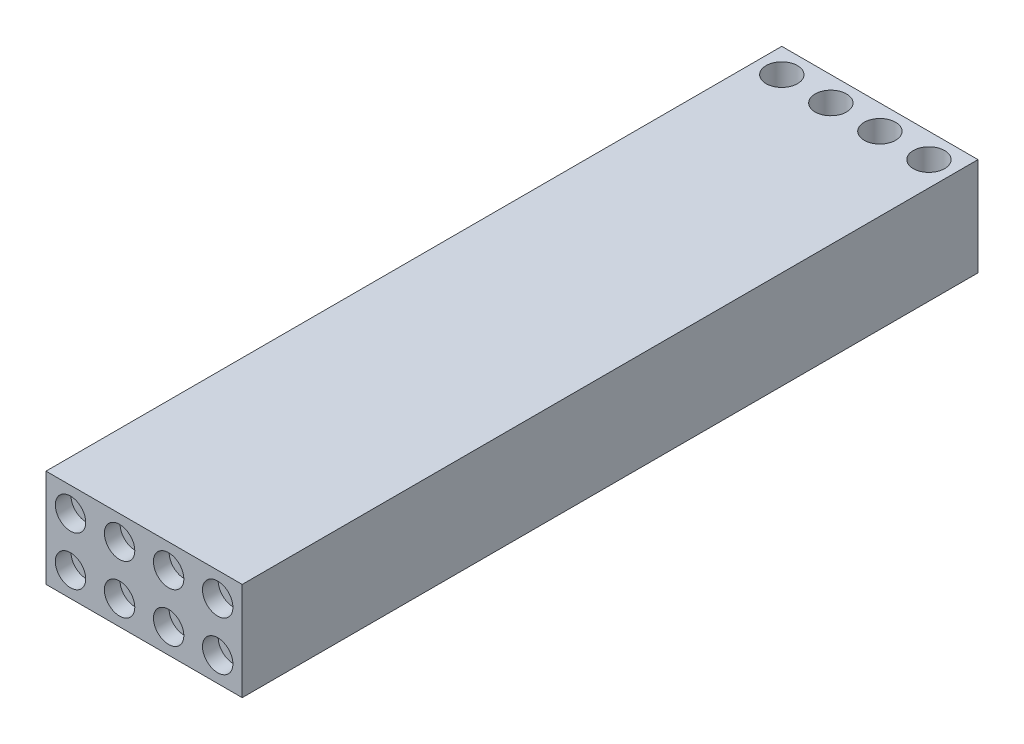
ISO-10303-21;
HEADER;
FILE_DESCRIPTION(('STEP AP214'),'2;1');
FILE_NAME('part.step','',(''),(''),'','','');
FILE_SCHEMA(('AUTOMOTIVE_DESIGN { 1 0 10303 214 1 1 1 1 }'));
ENDSEC;
DATA;
#1=APPLICATION_CONTEXT('core data for automotive mechanical design processes');
#2=APPLICATION_PROTOCOL_DEFINITION('international standard','automotive_design',2000,#1);
#3=PRODUCT_CONTEXT('',#1,'mechanical');
#4=PRODUCT('Part','Part','',(#3));
#5=PRODUCT_RELATED_PRODUCT_CATEGORY('part','',(#4));
#6=PRODUCT_DEFINITION_FORMATION('','',#4);
#7=PRODUCT_DEFINITION_CONTEXT('part definition',#1,'design');
#8=PRODUCT_DEFINITION('design','',#6,#7);
#9=PRODUCT_DEFINITION_SHAPE('','',#8);
#10=(LENGTH_UNIT() NAMED_UNIT(*) SI_UNIT(.MILLI.,.METRE.));
#11=(NAMED_UNIT(*) PLANE_ANGLE_UNIT() SI_UNIT($,.RADIAN.));
#12=(NAMED_UNIT(*) SI_UNIT($,.STERADIAN.) SOLID_ANGLE_UNIT());
#13=UNCERTAINTY_MEASURE_WITH_UNIT(LENGTH_MEASURE(1.E-05),#10,'distance_accuracy_value','');
#14=(GEOMETRIC_REPRESENTATION_CONTEXT(3) GLOBAL_UNCERTAINTY_ASSIGNED_CONTEXT((#13)) GLOBAL_UNIT_ASSIGNED_CONTEXT((#10,
#11,#12)) REPRESENTATION_CONTEXT('',''));
#15=CARTESIAN_POINT('',(0.,0.,0.));
#16=DIRECTION('',(0.,0.,1.));
#17=DIRECTION('',(1.,0.,0.));
#18=AXIS2_PLACEMENT_3D('',#15,#16,#17);
#19=CARTESIAN_POINT('',(10.,10.,150.));
#20=DIRECTION('',(-1.,0.,0.));
#21=DIRECTION('',(0.,-1.,0.));
#22=AXIS2_PLACEMENT_3D('',#19,#20,#21);
#23=PLANE('',#22);
#24=DIRECTION('',(0.,1.,0.));
#25=VECTOR('',#24,1.);
#26=CARTESIAN_POINT('',(10.,10.,0.));
#27=LINE('',#26,#25);
#28=CARTESIAN_POINT('',(10.,-10.,0.));
#29=VERTEX_POINT('',#28);
#30=CARTESIAN_POINT('',(10.,10.,0.));
#31=VERTEX_POINT('',#30);
#32=EDGE_CURVE('E87',#29,#31,#27,.T.);
#33=ORIENTED_EDGE('',*,*,#32,.T.);
#34=DIRECTION('',(0.,0.,-1.));
#35=VECTOR('',#34,1.);
#36=CARTESIAN_POINT('',(10.,10.,150.));
#37=LINE('',#36,#35);
#38=CARTESIAN_POINT('',(10.,10.,150.));
#39=VERTEX_POINT('',#38);
#40=EDGE_CURVE('E11',#39,#31,#37,.T.);
#41=ORIENTED_EDGE('',*,*,#40,.F.);
#42=DIRECTION('',(0.,1.,0.));
#43=VECTOR('',#42,1.);
#44=CARTESIAN_POINT('',(10.,10.,150.));
#45=LINE('',#44,#43);
#46=CARTESIAN_POINT('',(10.,-10.,150.));
#47=VERTEX_POINT('',#46);
#48=EDGE_CURVE('E144',#47,#39,#45,.T.);
#49=ORIENTED_EDGE('',*,*,#48,.F.);
#50=DIRECTION('',(0.,0.,-1.));
#51=VECTOR('',#50,1.);
#52=CARTESIAN_POINT('',(10.,-10.,150.));
#53=LINE('',#52,#51);
#54=EDGE_CURVE('E47',#47,#29,#53,.T.);
#55=ORIENTED_EDGE('',*,*,#54,.T.);
#56=EDGE_LOOP('',(#33,#41,#49,#55));
#57=FACE_BOUND('',#56,.T.);
#58=ADVANCED_FACE('F39',(#57),#23,.F.);
#59=CARTESIAN_POINT('',(-10.,10.,150.));
#60=DIRECTION('',(0.,-1.,0.));
#61=DIRECTION('',(0.,0.,-1.));
#62=AXIS2_PLACEMENT_3D('',#59,#60,#61);
#63=PLANE('',#62);
#64=CARTESIAN_POINT('',(-25.,9.99999999999999,5.));
#65=DIRECTION('',(0.,-1.,0.));
#66=DIRECTION('',(0.,0.,1.));
#67=AXIS2_PLACEMENT_3D('',#64,#65,#66);
#68=CIRCLE('',#67,3.2);
#69=CARTESIAN_POINT('',(-25.,9.99999999999999,8.2));
#70=VERTEX_POINT('',#69);
#71=EDGE_CURVE('E180',#70,#70,#68,.T.);
#72=ORIENTED_EDGE('',*,*,#71,.T.);
#73=EDGE_LOOP('',(#72));
#74=FACE_BOUND('',#73,.T.);
#75=CARTESIAN_POINT('',(-15.,9.99999999999999,5.));
#76=DIRECTION('',(0.,1.,0.));
#77=DIRECTION('',(0.,0.,1.));
#78=AXIS2_PLACEMENT_3D('',#75,#76,#77);
#79=CIRCLE('',#78,3.2);
#80=CARTESIAN_POINT('',(-15.,9.99999999999999,8.2));
#81=VERTEX_POINT('',#80);
#82=EDGE_CURVE('E103',#81,#81,#79,.T.);
#83=ORIENTED_EDGE('',*,*,#82,.F.);
#84=EDGE_LOOP('',(#83));
#85=FACE_BOUND('',#84,.T.);
#86=CARTESIAN_POINT('',(-5.,10.,5.));
#87=DIRECTION('',(0.,-1.,0.));
#88=DIRECTION('',(0.,0.,1.));
#89=AXIS2_PLACEMENT_3D('',#86,#87,#88);
#90=CIRCLE('',#89,3.2);
#91=CARTESIAN_POINT('',(-5.,10.,8.2));
#92=VERTEX_POINT('',#91);
#93=EDGE_CURVE('E130',#92,#92,#90,.T.);
#94=ORIENTED_EDGE('',*,*,#93,.T.);
#95=EDGE_LOOP('',(#94));
#96=FACE_BOUND('',#95,.T.);
#97=CARTESIAN_POINT('',(5.,10.,5.));
#98=DIRECTION('',(0.,1.,0.));
#99=DIRECTION('',(0.,0.,1.));
#100=AXIS2_PLACEMENT_3D('',#97,#98,#99);
#101=CIRCLE('',#100,3.2);
#102=CARTESIAN_POINT('',(5.,10.,8.2));
#103=VERTEX_POINT('',#102);
#104=EDGE_CURVE('E136',#103,#103,#101,.T.);
#105=ORIENTED_EDGE('',*,*,#104,.F.);
#106=EDGE_LOOP('',(#105));
#107=FACE_BOUND('',#106,.T.);
#108=DIRECTION('',(-1.,0.,0.));
#109=VECTOR('',#108,1.);
#110=CARTESIAN_POINT('',(-10.,10.,0.));
#111=LINE('',#110,#109);
#112=CARTESIAN_POINT('',(-30.,9.99999999999999,0.));
#113=VERTEX_POINT('',#112);
#114=EDGE_CURVE('E67',#31,#113,#111,.T.);
#115=ORIENTED_EDGE('',*,*,#114,.T.);
#116=DIRECTION('',(0.,0.,-1.));
#117=VECTOR('',#116,1.);
#118=CARTESIAN_POINT('',(-30.,9.99999999999999,150.));
#119=LINE('',#118,#117);
#120=CARTESIAN_POINT('',(-30.,9.99999999999999,150.));
#121=VERTEX_POINT('',#120);
#122=EDGE_CURVE('E82',#121,#113,#119,.T.);
#123=ORIENTED_EDGE('',*,*,#122,.F.);
#124=DIRECTION('',(-1.,0.,0.));
#125=VECTOR('',#124,1.);
#126=CARTESIAN_POINT('',(-10.,10.,150.));
#127=LINE('',#126,#125);
#128=EDGE_CURVE('E72',#39,#121,#127,.T.);
#129=ORIENTED_EDGE('',*,*,#128,.F.);
#130=ORIENTED_EDGE('',*,*,#40,.T.);
#131=EDGE_LOOP('',(#115,#123,#129,#130));
#132=FACE_BOUND('',#131,.T.);
#133=ADVANCED_FACE('F81',(#74,#85,#96,#107,#132),#63,.F.);
#134=CARTESIAN_POINT('',(-10.,-10.,150.));
#135=DIRECTION('',(0.,1.,0.));
#136=DIRECTION('',(0.,0.,1.));
#137=AXIS2_PLACEMENT_3D('',#134,#135,#136);
#138=PLANE('',#137);
#139=DIRECTION('',(1.,0.,0.));
#140=VECTOR('',#139,1.);
#141=CARTESIAN_POINT('',(-10.,-10.,0.));
#142=LINE('',#141,#140);
#143=CARTESIAN_POINT('',(-30.,-10.,0.));
#144=VERTEX_POINT('',#143);
#145=EDGE_CURVE('E86',#144,#29,#142,.T.);
#146=ORIENTED_EDGE('',*,*,#145,.T.);
#147=ORIENTED_EDGE('',*,*,#54,.F.);
#148=DIRECTION('',(1.,0.,0.));
#149=VECTOR('',#148,1.);
#150=CARTESIAN_POINT('',(-10.,-10.,150.));
#151=LINE('',#150,#149);
#152=CARTESIAN_POINT('',(-30.,-10.,150.));
#153=VERTEX_POINT('',#152);
#154=EDGE_CURVE('E55',#153,#47,#151,.T.);
#155=ORIENTED_EDGE('',*,*,#154,.F.);
#156=DIRECTION('',(0.,0.,-1.));
#157=VECTOR('',#156,1.);
#158=CARTESIAN_POINT('',(-30.,-10.,150.));
#159=LINE('',#158,#157);
#160=EDGE_CURVE('E95',#153,#144,#159,.T.);
#161=ORIENTED_EDGE('',*,*,#160,.T.);
#162=EDGE_LOOP('',(#146,#147,#155,#161));
#163=FACE_BOUND('',#162,.T.);
#164=ADVANCED_FACE('F153',(#163),#138,.F.);
#165=CARTESIAN_POINT('',(0.,0.,150.));
#166=DIRECTION('',(0.,0.,1.));
#167=DIRECTION('',(1.,0.,0.));
#168=AXIS2_PLACEMENT_3D('',#165,#166,#167);
#169=PLANE('',#168);
#170=CARTESIAN_POINT('',(-25.,-5.,150.));
#171=DIRECTION('',(0.,0.,1.));
#172=DIRECTION('',(-1.,0.,0.));
#173=AXIS2_PLACEMENT_3D('',#170,#171,#172);
#174=CIRCLE('',#173,3.1);
#175=CARTESIAN_POINT('',(-28.1,-5.,150.));
#176=VERTEX_POINT('',#175);
#177=EDGE_CURVE('E291',#176,#176,#174,.T.);
#178=ORIENTED_EDGE('',*,*,#177,.F.);
#179=EDGE_LOOP('',(#178));
#180=FACE_BOUND('',#179,.T.);
#181=CARTESIAN_POINT('',(-25.,4.99999999999999,150.));
#182=DIRECTION('',(0.,0.,-1.));
#183=DIRECTION('',(-1.,0.,0.));
#184=AXIS2_PLACEMENT_3D('',#181,#182,#183);
#185=CIRCLE('',#184,3.1);
#186=CARTESIAN_POINT('',(-28.1,4.99999999999999,150.));
#187=VERTEX_POINT('',#186);
#188=EDGE_CURVE('E290',#187,#187,#185,.T.);
#189=ORIENTED_EDGE('',*,*,#188,.T.);
#190=EDGE_LOOP('',(#189));
#191=FACE_BOUND('',#190,.T.);
#192=CARTESIAN_POINT('',(-15.,-5.,150.));
#193=DIRECTION('',(0.,0.,-1.));
#194=DIRECTION('',(1.,0.,0.));
#195=AXIS2_PLACEMENT_3D('',#192,#193,#194);
#196=CIRCLE('',#195,3.1);
#197=CARTESIAN_POINT('',(-11.9,-5.,150.));
#198=VERTEX_POINT('',#197);
#199=EDGE_CURVE('E304',#198,#198,#196,.T.);
#200=ORIENTED_EDGE('',*,*,#199,.T.);
#201=EDGE_LOOP('',(#200));
#202=FACE_BOUND('',#201,.T.);
#203=CARTESIAN_POINT('',(-15.,4.99999999999999,150.));
#204=DIRECTION('',(0.,0.,1.));
#205=DIRECTION('',(1.,0.,0.));
#206=AXIS2_PLACEMENT_3D('',#203,#204,#205);
#207=CIRCLE('',#206,3.1);
#208=CARTESIAN_POINT('',(-11.9,4.99999999999999,150.));
#209=VERTEX_POINT('',#208);
#210=EDGE_CURVE('E309',#209,#209,#207,.T.);
#211=ORIENTED_EDGE('',*,*,#210,.F.);
#212=EDGE_LOOP('',(#211));
#213=FACE_BOUND('',#212,.T.);
#214=CARTESIAN_POINT('',(-5.,-5.,150.));
#215=DIRECTION('',(0.,0.,1.));
#216=DIRECTION('',(-1.,0.,0.));
#217=AXIS2_PLACEMENT_3D('',#214,#215,#216);
#218=CIRCLE('',#217,3.1);
#219=CARTESIAN_POINT('',(-8.1,-5.,150.));
#220=VERTEX_POINT('',#219);
#221=EDGE_CURVE('E108',#220,#220,#218,.T.);
#222=ORIENTED_EDGE('',*,*,#221,.F.);
#223=EDGE_LOOP('',(#222));
#224=FACE_BOUND('',#223,.T.);
#225=CARTESIAN_POINT('',(-5.,5.,150.));
#226=DIRECTION('',(0.,0.,-1.));
#227=DIRECTION('',(-1.,0.,0.));
#228=AXIS2_PLACEMENT_3D('',#225,#226,#227);
#229=CIRCLE('',#228,3.1);
#230=CARTESIAN_POINT('',(-8.1,5.,150.));
#231=VERTEX_POINT('',#230);
#232=EDGE_CURVE('E112',#231,#231,#229,.T.);
#233=ORIENTED_EDGE('',*,*,#232,.T.);
#234=EDGE_LOOP('',(#233));
#235=FACE_BOUND('',#234,.T.);
#236=CARTESIAN_POINT('',(5.,-5.,150.));
#237=DIRECTION('',(0.,0.,-1.));
#238=DIRECTION('',(1.,0.,0.));
#239=AXIS2_PLACEMENT_3D('',#236,#237,#238);
#240=CIRCLE('',#239,3.1);
#241=CARTESIAN_POINT('',(8.1,-5.,150.));
#242=VERTEX_POINT('',#241);
#243=EDGE_CURVE('E118',#242,#242,#240,.T.);
#244=ORIENTED_EDGE('',*,*,#243,.T.);
#245=EDGE_LOOP('',(#244));
#246=FACE_BOUND('',#245,.T.);
#247=CARTESIAN_POINT('',(5.,5.,150.));
#248=DIRECTION('',(0.,0.,1.));
#249=DIRECTION('',(1.,0.,0.));
#250=AXIS2_PLACEMENT_3D('',#247,#248,#249);
#251=CIRCLE('',#250,3.1);
#252=CARTESIAN_POINT('',(8.1,5.,150.));
#253=VERTEX_POINT('',#252);
#254=EDGE_CURVE('E124',#253,#253,#251,.T.);
#255=ORIENTED_EDGE('',*,*,#254,.F.);
#256=EDGE_LOOP('',(#255));
#257=FACE_BOUND('',#256,.T.);
#258=ORIENTED_EDGE('',*,*,#48,.T.);
#259=ORIENTED_EDGE('',*,*,#128,.T.);
#260=DIRECTION('',(0.,1.,0.));
#261=VECTOR('',#260,1.);
#262=CARTESIAN_POINT('',(-30.,9.99999999999999,150.));
#263=LINE('',#262,#261);
#264=EDGE_CURVE('E94',#153,#121,#263,.T.);
#265=ORIENTED_EDGE('',*,*,#264,.F.);
#266=ORIENTED_EDGE('',*,*,#154,.T.);
#267=EDGE_LOOP('',(#258,#259,#265,#266));
#268=FACE_BOUND('',#267,.T.);
#269=ADVANCED_FACE('F154',(#180,#191,#202,#213,#224,#235,#246,#257,#268),#169,.T.);
#270=CARTESIAN_POINT('',(0.,0.,0.));
#271=DIRECTION('',(0.,0.,1.));
#272=DIRECTION('',(1.,0.,0.));
#273=AXIS2_PLACEMENT_3D('',#270,#271,#272);
#274=PLANE('',#273);
#275=ORIENTED_EDGE('',*,*,#32,.F.);
#276=ORIENTED_EDGE('',*,*,#145,.F.);
#277=DIRECTION('',(0.,1.,0.));
#278=VECTOR('',#277,1.);
#279=CARTESIAN_POINT('',(-30.,9.99999999999999,0.));
#280=LINE('',#279,#278);
#281=EDGE_CURVE('E93',#144,#113,#280,.T.);
#282=ORIENTED_EDGE('',*,*,#281,.T.);
#283=ORIENTED_EDGE('',*,*,#114,.F.);
#284=EDGE_LOOP('',(#275,#276,#282,#283));
#285=FACE_BOUND('',#284,.T.);
#286=ADVANCED_FACE('F97',(#285),#274,.F.);
#287=CARTESIAN_POINT('',(5.,-8.,5.));
#288=DIRECTION('',(0.,1.,0.));
#289=DIRECTION('',(0.,0.,1.));
#290=AXIS2_PLACEMENT_3D('',#287,#288,#289);
#291=CYLINDRICAL_SURFACE('',#290,3.2);
#292=CARTESIAN_POINT('',(5.,-8.,5.));
#293=DIRECTION('',(0.,1.,0.));
#294=DIRECTION('',(0.,0.,1.));
#295=AXIS2_PLACEMENT_3D('',#292,#293,#294);
#296=CIRCLE('',#295,3.2);
#297=CARTESIAN_POINT('',(5.,-8.,8.2));
#298=VERTEX_POINT('',#297);
#299=EDGE_CURVE('E139',#298,#298,#296,.T.);
#300=ORIENTED_EDGE('',*,*,#299,.F.);
#301=EDGE_LOOP('',(#300));
#302=FACE_BOUND('',#301,.T.);
#303=ORIENTED_EDGE('',*,*,#104,.T.);
#304=EDGE_LOOP('',(#303));
#305=FACE_BOUND('',#304,.T.);
#306=ADVANCED_FACE('F162',(#302,#305),#291,.F.);
#307=CARTESIAN_POINT('',(5.,-8.,5.));
#308=DIRECTION('',(0.,1.,0.));
#309=DIRECTION('',(0.,0.,1.));
#310=AXIS2_PLACEMENT_3D('',#307,#308,#309);
#311=PLANE('',#310);
#312=ORIENTED_EDGE('',*,*,#299,.T.);
#313=EDGE_LOOP('',(#312));
#314=FACE_BOUND('',#313,.T.);
#315=ADVANCED_FACE('F188',(#314),#311,.T.);
#316=CARTESIAN_POINT('',(-5.,-8.,5.));
#317=DIRECTION('',(0.,1.,0.));
#318=DIRECTION('',(0.,0.,1.));
#319=AXIS2_PLACEMENT_3D('',#316,#317,#318);
#320=CYLINDRICAL_SURFACE('',#319,3.2);
#321=CARTESIAN_POINT('',(-5.,-8.,5.));
#322=DIRECTION('',(0.,-1.,0.));
#323=DIRECTION('',(0.,0.,1.));
#324=AXIS2_PLACEMENT_3D('',#321,#322,#323);
#325=CIRCLE('',#324,3.2);
#326=CARTESIAN_POINT('',(-5.,-8.,8.2));
#327=VERTEX_POINT('',#326);
#328=EDGE_CURVE('E133',#327,#327,#325,.T.);
#329=ORIENTED_EDGE('',*,*,#328,.T.);
#330=EDGE_LOOP('',(#329));
#331=FACE_BOUND('',#330,.T.);
#332=ORIENTED_EDGE('',*,*,#93,.F.);
#333=EDGE_LOOP('',(#332));
#334=FACE_BOUND('',#333,.T.);
#335=ADVANCED_FACE('F193',(#331,#334),#320,.F.);
#336=CARTESIAN_POINT('',(-5.,-8.,5.));
#337=DIRECTION('',(0.,1.,0.));
#338=DIRECTION('',(0.,0.,1.));
#339=AXIS2_PLACEMENT_3D('',#336,#337,#338);
#340=PLANE('',#339);
#341=ORIENTED_EDGE('',*,*,#328,.F.);
#342=EDGE_LOOP('',(#341));
#343=FACE_BOUND('',#342,.T.);
#344=ADVANCED_FACE('F200',(#343),#340,.T.);
#345=CARTESIAN_POINT('',(5.,5.,146.8));
#346=DIRECTION('',(0.,0.,1.));
#347=DIRECTION('',(1.,0.,0.));
#348=AXIS2_PLACEMENT_3D('',#345,#346,#347);
#349=CYLINDRICAL_SURFACE('',#348,3.1);
#350=CARTESIAN_POINT('',(5.,5.,146.8));
#351=DIRECTION('',(0.,0.,1.));
#352=DIRECTION('',(1.,0.,0.));
#353=AXIS2_PLACEMENT_3D('',#350,#351,#352);
#354=CIRCLE('',#353,3.1);
#355=CARTESIAN_POINT('',(8.1,5.,146.8));
#356=VERTEX_POINT('',#355);
#357=EDGE_CURVE('E127',#356,#356,#354,.T.);
#358=ORIENTED_EDGE('',*,*,#357,.F.);
#359=EDGE_LOOP('',(#358));
#360=FACE_BOUND('',#359,.T.);
#361=ORIENTED_EDGE('',*,*,#254,.T.);
#362=EDGE_LOOP('',(#361));
#363=FACE_BOUND('',#362,.T.);
#364=ADVANCED_FACE('F204',(#360,#363),#349,.F.);
#365=CARTESIAN_POINT('',(5.,5.,146.8));
#366=DIRECTION('',(0.,0.,1.));
#367=DIRECTION('',(1.,0.,0.));
#368=AXIS2_PLACEMENT_3D('',#365,#366,#367);
#369=PLANE('',#368);
#370=ORIENTED_EDGE('',*,*,#357,.T.);
#371=EDGE_LOOP('',(#370));
#372=FACE_BOUND('',#371,.T.);
#373=ADVANCED_FACE('F208',(#372),#369,.T.);
#374=CARTESIAN_POINT('',(5.,-5.,146.8));
#375=DIRECTION('',(0.,0.,1.));
#376=DIRECTION('',(1.,0.,0.));
#377=AXIS2_PLACEMENT_3D('',#374,#375,#376);
#378=CYLINDRICAL_SURFACE('',#377,3.1);
#379=CARTESIAN_POINT('',(5.,-5.,146.8));
#380=DIRECTION('',(0.,0.,-1.));
#381=DIRECTION('',(1.,0.,0.));
#382=AXIS2_PLACEMENT_3D('',#379,#380,#381);
#383=CIRCLE('',#382,3.1);
#384=CARTESIAN_POINT('',(8.1,-5.,146.8));
#385=VERTEX_POINT('',#384);
#386=EDGE_CURVE('E121',#385,#385,#383,.T.);
#387=ORIENTED_EDGE('',*,*,#386,.T.);
#388=EDGE_LOOP('',(#387));
#389=FACE_BOUND('',#388,.T.);
#390=ORIENTED_EDGE('',*,*,#243,.F.);
#391=EDGE_LOOP('',(#390));
#392=FACE_BOUND('',#391,.T.);
#393=ADVANCED_FACE('F212',(#389,#392),#378,.F.);
#394=CARTESIAN_POINT('',(5.,-5.,146.8));
#395=DIRECTION('',(0.,0.,1.));
#396=DIRECTION('',(1.,0.,0.));
#397=AXIS2_PLACEMENT_3D('',#394,#395,#396);
#398=PLANE('',#397);
#399=ORIENTED_EDGE('',*,*,#386,.F.);
#400=EDGE_LOOP('',(#399));
#401=FACE_BOUND('',#400,.T.);
#402=ADVANCED_FACE('F216',(#401),#398,.T.);
#403=CARTESIAN_POINT('',(-5.,5.,146.8));
#404=DIRECTION('',(0.,0.,1.));
#405=DIRECTION('',(1.,0.,0.));
#406=AXIS2_PLACEMENT_3D('',#403,#404,#405);
#407=CYLINDRICAL_SURFACE('',#406,3.1);
#408=CARTESIAN_POINT('',(-5.,5.,146.8));
#409=DIRECTION('',(0.,0.,-1.));
#410=DIRECTION('',(-1.,0.,0.));
#411=AXIS2_PLACEMENT_3D('',#408,#409,#410);
#412=CIRCLE('',#411,3.1);
#413=CARTESIAN_POINT('',(-8.1,5.,146.8));
#414=VERTEX_POINT('',#413);
#415=EDGE_CURVE('E115',#414,#414,#412,.T.);
#416=ORIENTED_EDGE('',*,*,#415,.T.);
#417=EDGE_LOOP('',(#416));
#418=FACE_BOUND('',#417,.T.);
#419=ORIENTED_EDGE('',*,*,#232,.F.);
#420=EDGE_LOOP('',(#419));
#421=FACE_BOUND('',#420,.T.);
#422=ADVANCED_FACE('F220',(#418,#421),#407,.F.);
#423=CARTESIAN_POINT('',(-5.,5.,146.8));
#424=DIRECTION('',(0.,0.,1.));
#425=DIRECTION('',(-1.,0.,0.));
#426=AXIS2_PLACEMENT_3D('',#423,#424,#425);
#427=PLANE('',#426);
#428=ORIENTED_EDGE('',*,*,#415,.F.);
#429=EDGE_LOOP('',(#428));
#430=FACE_BOUND('',#429,.T.);
#431=ADVANCED_FACE('F224',(#430),#427,.T.);
#432=CARTESIAN_POINT('',(-5.,-5.,146.8));
#433=DIRECTION('',(0.,0.,1.));
#434=DIRECTION('',(1.,0.,0.));
#435=AXIS2_PLACEMENT_3D('',#432,#433,#434);
#436=CYLINDRICAL_SURFACE('',#435,3.1);
#437=CARTESIAN_POINT('',(-5.,-5.,146.8));
#438=DIRECTION('',(0.,0.,1.));
#439=DIRECTION('',(-1.,0.,0.));
#440=AXIS2_PLACEMENT_3D('',#437,#438,#439);
#441=CIRCLE('',#440,3.1);
#442=CARTESIAN_POINT('',(-8.1,-5.,146.8));
#443=VERTEX_POINT('',#442);
#444=EDGE_CURVE('E109',#443,#443,#441,.T.);
#445=ORIENTED_EDGE('',*,*,#444,.F.);
#446=EDGE_LOOP('',(#445));
#447=FACE_BOUND('',#446,.T.);
#448=ORIENTED_EDGE('',*,*,#221,.T.);
#449=EDGE_LOOP('',(#448));
#450=FACE_BOUND('',#449,.T.);
#451=ADVANCED_FACE('F228',(#447,#450),#436,.F.);
#452=CARTESIAN_POINT('',(-5.,-5.,146.8));
#453=DIRECTION('',(0.,0.,1.));
#454=DIRECTION('',(-1.,0.,0.));
#455=AXIS2_PLACEMENT_3D('',#452,#453,#454);
#456=PLANE('',#455);
#457=ORIENTED_EDGE('',*,*,#444,.T.);
#458=EDGE_LOOP('',(#457));
#459=FACE_BOUND('',#458,.T.);
#460=ADVANCED_FACE('F232',(#459),#456,.T.);
#461=CARTESIAN_POINT('',(-30.,9.99999999999999,150.));
#462=DIRECTION('',(-1.,0.,0.));
#463=DIRECTION('',(0.,-1.,0.));
#464=AXIS2_PLACEMENT_3D('',#461,#462,#463);
#465=PLANE('',#464);
#466=ORIENTED_EDGE('',*,*,#281,.F.);
#467=ORIENTED_EDGE('',*,*,#160,.F.);
#468=ORIENTED_EDGE('',*,*,#264,.T.);
#469=ORIENTED_EDGE('',*,*,#122,.T.);
#470=EDGE_LOOP('',(#466,#467,#468,#469));
#471=FACE_BOUND('',#470,.T.);
#472=ADVANCED_FACE('F91',(#471),#465,.T.);
#473=CARTESIAN_POINT('',(-15.,-8.,5.));
#474=DIRECTION('',(0.,1.,0.));
#475=DIRECTION('',(-1.,0.,0.));
#476=AXIS2_PLACEMENT_3D('',#473,#474,#475);
#477=CYLINDRICAL_SURFACE('',#476,3.2);
#478=CARTESIAN_POINT('',(-15.,-8.,5.));
#479=DIRECTION('',(0.,1.,0.));
#480=DIRECTION('',(0.,0.,1.));
#481=AXIS2_PLACEMENT_3D('',#478,#479,#480);
#482=CIRCLE('',#481,3.2);
#483=CARTESIAN_POINT('',(-15.,-8.,8.2));
#484=VERTEX_POINT('',#483);
#485=EDGE_CURVE('E99',#484,#484,#482,.T.);
#486=ORIENTED_EDGE('',*,*,#485,.F.);
#487=EDGE_LOOP('',(#486));
#488=FACE_BOUND('',#487,.T.);
#489=ORIENTED_EDGE('',*,*,#82,.T.);
#490=EDGE_LOOP('',(#489));
#491=FACE_BOUND('',#490,.T.);
#492=ADVANCED_FACE('F238',(#488,#491),#477,.F.);
#493=CARTESIAN_POINT('',(-15.,-8.,5.));
#494=DIRECTION('',(0.,1.,0.));
#495=DIRECTION('',(0.,0.,1.));
#496=AXIS2_PLACEMENT_3D('',#493,#494,#495);
#497=PLANE('',#496);
#498=ORIENTED_EDGE('',*,*,#485,.T.);
#499=EDGE_LOOP('',(#498));
#500=FACE_BOUND('',#499,.T.);
#501=ADVANCED_FACE('F241',(#500),#497,.T.);
#502=CARTESIAN_POINT('',(-15.,4.99999999999999,146.8));
#503=DIRECTION('',(0.,0.,1.));
#504=DIRECTION('',(1.,0.,0.));
#505=AXIS2_PLACEMENT_3D('',#502,#503,#504);
#506=CYLINDRICAL_SURFACE('',#505,3.1);
#507=CARTESIAN_POINT('',(-15.,4.99999999999999,146.8));
#508=DIRECTION('',(0.,0.,1.));
#509=DIRECTION('',(1.,0.,0.));
#510=AXIS2_PLACEMENT_3D('',#507,#508,#509);
#511=CIRCLE('',#510,3.1);
#512=CARTESIAN_POINT('',(-11.9,4.99999999999999,146.8));
#513=VERTEX_POINT('',#512);
#514=EDGE_CURVE('E312',#513,#513,#511,.T.);
#515=ORIENTED_EDGE('',*,*,#514,.F.);
#516=EDGE_LOOP('',(#515));
#517=FACE_BOUND('',#516,.T.);
#518=ORIENTED_EDGE('',*,*,#210,.T.);
#519=EDGE_LOOP('',(#518));
#520=FACE_BOUND('',#519,.T.);
#521=ADVANCED_FACE('F245',(#517,#520),#506,.F.);
#522=CARTESIAN_POINT('',(-15.,4.99999999999999,146.8));
#523=DIRECTION('',(0.,0.,1.));
#524=DIRECTION('',(1.,0.,0.));
#525=AXIS2_PLACEMENT_3D('',#522,#523,#524);
#526=PLANE('',#525);
#527=ORIENTED_EDGE('',*,*,#514,.T.);
#528=EDGE_LOOP('',(#527));
#529=FACE_BOUND('',#528,.T.);
#530=ADVANCED_FACE('F249',(#529),#526,.T.);
#531=CARTESIAN_POINT('',(-15.,-5.,146.8));
#532=DIRECTION('',(0.,0.,1.));
#533=DIRECTION('',(1.,0.,0.));
#534=AXIS2_PLACEMENT_3D('',#531,#532,#533);
#535=CYLINDRICAL_SURFACE('',#534,3.1);
#536=CARTESIAN_POINT('',(-15.,-5.,146.8));
#537=DIRECTION('',(0.,0.,-1.));
#538=DIRECTION('',(1.,0.,0.));
#539=AXIS2_PLACEMENT_3D('',#536,#537,#538);
#540=CIRCLE('',#539,3.1);
#541=CARTESIAN_POINT('',(-11.9,-5.,146.8));
#542=VERTEX_POINT('',#541);
#543=EDGE_CURVE('E306',#542,#542,#540,.T.);
#544=ORIENTED_EDGE('',*,*,#543,.T.);
#545=EDGE_LOOP('',(#544));
#546=FACE_BOUND('',#545,.T.);
#547=ORIENTED_EDGE('',*,*,#199,.F.);
#548=EDGE_LOOP('',(#547));
#549=FACE_BOUND('',#548,.T.);
#550=ADVANCED_FACE('F253',(#546,#549),#535,.F.);
#551=CARTESIAN_POINT('',(-15.,-5.,146.8));
#552=DIRECTION('',(0.,0.,1.));
#553=DIRECTION('',(1.,0.,0.));
#554=AXIS2_PLACEMENT_3D('',#551,#552,#553);
#555=PLANE('',#554);
#556=ORIENTED_EDGE('',*,*,#543,.F.);
#557=EDGE_LOOP('',(#556));
#558=FACE_BOUND('',#557,.T.);
#559=ADVANCED_FACE('F257',(#558),#555,.T.);
#560=CARTESIAN_POINT('',(-25.,-8.00000000000001,5.));
#561=DIRECTION('',(0.,1.,0.));
#562=DIRECTION('',(-1.,0.,0.));
#563=AXIS2_PLACEMENT_3D('',#560,#561,#562);
#564=CYLINDRICAL_SURFACE('',#563,3.2);
#565=CARTESIAN_POINT('',(-25.,-8.00000000000001,5.));
#566=DIRECTION('',(0.,-1.,0.));
#567=DIRECTION('',(0.,0.,1.));
#568=AXIS2_PLACEMENT_3D('',#565,#566,#567);
#569=CIRCLE('',#568,3.2);
#570=CARTESIAN_POINT('',(-25.,-8.00000000000001,8.2));
#571=VERTEX_POINT('',#570);
#572=EDGE_CURVE('E301',#571,#571,#569,.T.);
#573=ORIENTED_EDGE('',*,*,#572,.T.);
#574=EDGE_LOOP('',(#573));
#575=FACE_BOUND('',#574,.T.);
#576=ORIENTED_EDGE('',*,*,#71,.F.);
#577=EDGE_LOOP('',(#576));
#578=FACE_BOUND('',#577,.T.);
#579=ADVANCED_FACE('F261',(#575,#578),#564,.F.);
#580=CARTESIAN_POINT('',(-25.,-8.00000000000001,5.));
#581=DIRECTION('',(0.,1.,0.));
#582=DIRECTION('',(0.,0.,1.));
#583=AXIS2_PLACEMENT_3D('',#580,#581,#582);
#584=PLANE('',#583);
#585=ORIENTED_EDGE('',*,*,#572,.F.);
#586=EDGE_LOOP('',(#585));
#587=FACE_BOUND('',#586,.T.);
#588=ADVANCED_FACE('F265',(#587),#584,.T.);
#589=CARTESIAN_POINT('',(-25.,4.99999999999999,146.8));
#590=DIRECTION('',(0.,0.,1.));
#591=DIRECTION('',(1.,0.,0.));
#592=AXIS2_PLACEMENT_3D('',#589,#590,#591);
#593=CYLINDRICAL_SURFACE('',#592,3.1);
#594=CARTESIAN_POINT('',(-25.,4.99999999999999,146.8));
#595=DIRECTION('',(0.,0.,-1.));
#596=DIRECTION('',(-1.,0.,0.));
#597=AXIS2_PLACEMENT_3D('',#594,#595,#596);
#598=CIRCLE('',#597,3.1);
#599=CARTESIAN_POINT('',(-28.1,4.99999999999999,146.8));
#600=VERTEX_POINT('',#599);
#601=EDGE_CURVE('E294',#600,#600,#598,.T.);
#602=ORIENTED_EDGE('',*,*,#601,.T.);
#603=EDGE_LOOP('',(#602));
#604=FACE_BOUND('',#603,.T.);
#605=ORIENTED_EDGE('',*,*,#188,.F.);
#606=EDGE_LOOP('',(#605));
#607=FACE_BOUND('',#606,.T.);
#608=ADVANCED_FACE('F269',(#604,#607),#593,.F.);
#609=CARTESIAN_POINT('',(-25.,4.99999999999999,146.8));
#610=DIRECTION('',(0.,0.,1.));
#611=DIRECTION('',(-1.,0.,0.));
#612=AXIS2_PLACEMENT_3D('',#609,#610,#611);
#613=PLANE('',#612);
#614=ORIENTED_EDGE('',*,*,#601,.F.);
#615=EDGE_LOOP('',(#614));
#616=FACE_BOUND('',#615,.T.);
#617=ADVANCED_FACE('F273',(#616),#613,.T.);
#618=CARTESIAN_POINT('',(-25.,-5.,146.8));
#619=DIRECTION('',(0.,0.,1.));
#620=DIRECTION('',(1.,0.,0.));
#621=AXIS2_PLACEMENT_3D('',#618,#619,#620);
#622=CYLINDRICAL_SURFACE('',#621,3.1);
#623=CARTESIAN_POINT('',(-25.,-5.,146.8));
#624=DIRECTION('',(0.,0.,1.));
#625=DIRECTION('',(-1.,0.,0.));
#626=AXIS2_PLACEMENT_3D('',#623,#624,#625);
#627=CIRCLE('',#626,3.1);
#628=CARTESIAN_POINT('',(-28.1,-5.,146.8));
#629=VERTEX_POINT('',#628);
#630=EDGE_CURVE('E289',#629,#629,#627,.T.);
#631=ORIENTED_EDGE('',*,*,#630,.F.);
#632=EDGE_LOOP('',(#631));
#633=FACE_BOUND('',#632,.T.);
#634=ORIENTED_EDGE('',*,*,#177,.T.);
#635=EDGE_LOOP('',(#634));
#636=FACE_BOUND('',#635,.T.);
#637=ADVANCED_FACE('F277',(#633,#636),#622,.F.);
#638=CARTESIAN_POINT('',(-25.,-5.,146.8));
#639=DIRECTION('',(0.,0.,1.));
#640=DIRECTION('',(-1.,0.,0.));
#641=AXIS2_PLACEMENT_3D('',#638,#639,#640);
#642=PLANE('',#641);
#643=ORIENTED_EDGE('',*,*,#630,.T.);
#644=EDGE_LOOP('',(#643));
#645=FACE_BOUND('',#644,.T.);
#646=ADVANCED_FACE('F281',(#645),#642,.T.);
#647=CLOSED_SHELL('',(#58,#133,#164,#269,#286,#306,#315,#335,#344,#364,#373,#393,#402,#422,#431,
#451,#460,#472,#492,#501,#521,#530,#550,#559,#579,#588,#608,#617,#637,#646));
#648=MANIFOLD_SOLID_BREP('B2',#647);
#649=ADVANCED_BREP_SHAPE_REPRESENTATION('',(#18,#648),#14);
#650=SHAPE_DEFINITION_REPRESENTATION(#9,#649);
ENDSEC;
END-ISO-10303-21;
